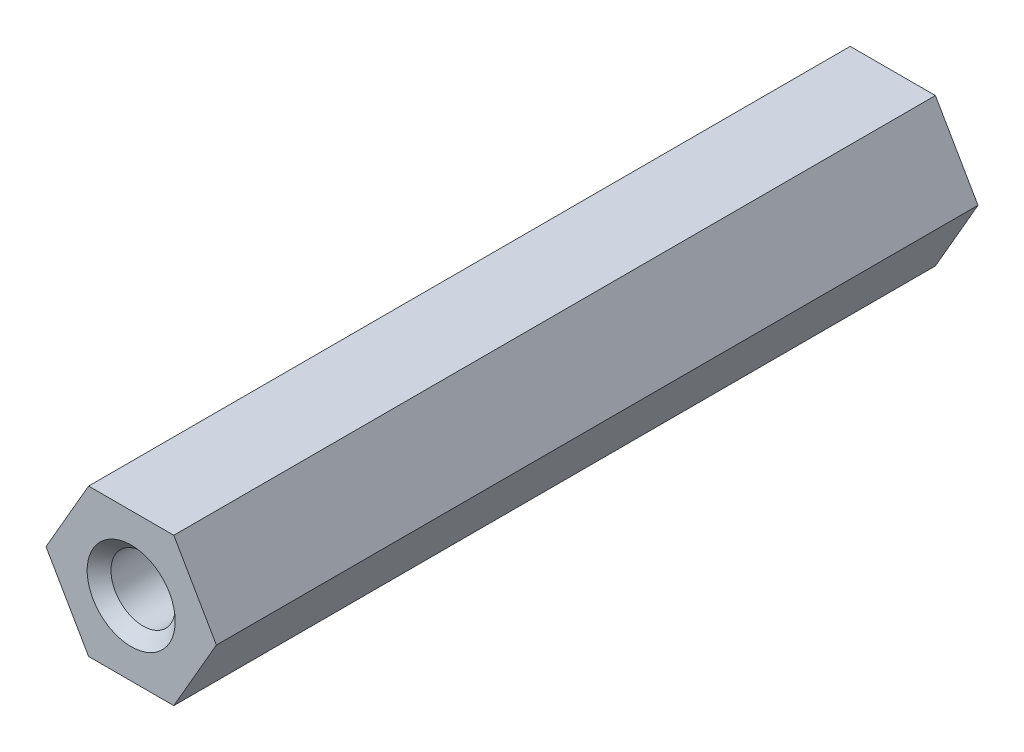
ISO-10303-21;
HEADER;
FILE_DESCRIPTION(('STEP AP214'),'2;1');
FILE_NAME('part.step','',(''),(''),'','','');
FILE_SCHEMA(('AUTOMOTIVE_DESIGN { 1 0 10303 214 1 1 1 1 }'));
ENDSEC;
DATA;
#1=APPLICATION_CONTEXT('core data for automotive mechanical design processes');
#2=APPLICATION_PROTOCOL_DEFINITION('international standard','automotive_design',2000,#1);
#3=PRODUCT_CONTEXT('',#1,'mechanical');
#4=PRODUCT('Part','Part','',(#3));
#5=PRODUCT_RELATED_PRODUCT_CATEGORY('part','',(#4));
#6=PRODUCT_DEFINITION_FORMATION('','',#4);
#7=PRODUCT_DEFINITION_CONTEXT('part definition',#1,'design');
#8=PRODUCT_DEFINITION('design','',#6,#7);
#9=PRODUCT_DEFINITION_SHAPE('','',#8);
#10=(LENGTH_UNIT() NAMED_UNIT(*) SI_UNIT(.MILLI.,.METRE.));
#11=(NAMED_UNIT(*) PLANE_ANGLE_UNIT() SI_UNIT($,.RADIAN.));
#12=(NAMED_UNIT(*) SI_UNIT($,.STERADIAN.) SOLID_ANGLE_UNIT());
#13=UNCERTAINTY_MEASURE_WITH_UNIT(LENGTH_MEASURE(1.E-05),#10,'distance_accuracy_value','');
#14=(GEOMETRIC_REPRESENTATION_CONTEXT(3) GLOBAL_UNCERTAINTY_ASSIGNED_CONTEXT((#13)) GLOBAL_UNIT_ASSIGNED_CONTEXT((#10,
#11,#12)) REPRESENTATION_CONTEXT('',''));
#15=CARTESIAN_POINT('',(0.,0.,0.));
#16=DIRECTION('',(0.,0.,1.));
#17=DIRECTION('',(1.,0.,0.));
#18=AXIS2_PLACEMENT_3D('',#15,#16,#17);
#19=CARTESIAN_POINT('',(-26.2468716349548,-11.1145142617312,4.23950473579815));
#20=DIRECTION('',(0.866025403784438,-0.500000000000001,0.));
#21=DIRECTION('',(0.500000000000001,0.866025403784438,0.));
#22=AXIS2_PLACEMENT_3D('',#19,#20,#21);
#23=PLANE('',#22);
#24=DIRECTION('',(0.500000000000001,0.866025403784438,0.));
#25=VECTOR('',#24,1.);
#26=CARTESIAN_POINT('',(-26.2468716349548,-11.1145142617312,36.2395047357982));
#27=LINE('',#26,#25);
#28=CARTESIAN_POINT('',(-26.2468716349548,-11.1145142617312,36.2395047357982));
#29=VERTEX_POINT('',#28);
#30=CARTESIAN_POINT('',(-24.4570858004669,-8.01451426173116,36.2395047357982));
#31=VERTEX_POINT('',#30);
#32=EDGE_CURVE('E126',#29,#31,#27,.T.);
#33=ORIENTED_EDGE('',*,*,#32,.F.);
#34=DIRECTION('',(0.,0.,1.));
#35=VECTOR('',#34,1.);
#36=CARTESIAN_POINT('',(-26.2468716349548,-11.1145142617312,4.23950473579815));
#37=LINE('',#36,#35);
#38=CARTESIAN_POINT('',(-26.2468716349548,-11.1145142617312,4.23950473579815));
#39=VERTEX_POINT('',#38);
#40=EDGE_CURVE('E55',#39,#29,#37,.T.);
#41=ORIENTED_EDGE('',*,*,#40,.F.);
#42=DIRECTION('',(0.500000000000001,0.866025403784438,0.));
#43=VECTOR('',#42,1.);
#44=CARTESIAN_POINT('',(-26.2468716349548,-11.1145142617312,4.23950473579815));
#45=LINE('',#44,#43);
#46=CARTESIAN_POINT('',(-24.4570858004669,-8.01451426173116,4.23950473579815));
#47=VERTEX_POINT('',#46);
#48=EDGE_CURVE('E141',#39,#47,#45,.T.);
#49=ORIENTED_EDGE('',*,*,#48,.T.);
#50=DIRECTION('',(0.,0.,1.));
#51=VECTOR('',#50,1.);
#52=CARTESIAN_POINT('',(-24.4570858004669,-8.01451426173116,4.23950473579815));
#53=LINE('',#52,#51);
#54=EDGE_CURVE('E90',#47,#31,#53,.T.);
#55=ORIENTED_EDGE('',*,*,#54,.T.);
#56=EDGE_LOOP('',(#33,#41,#49,#55));
#57=FACE_BOUND('',#56,.T.);
#58=ADVANCED_FACE('F37',(#57),#23,.T.);
#59=CARTESIAN_POINT('',(-29.8264433039305,-11.1145142617312,4.23950473579815));
#60=DIRECTION('',(0.,-1.,0.));
#61=DIRECTION('',(0.,0.,-1.));
#62=AXIS2_PLACEMENT_3D('',#59,#60,#61);
#63=PLANE('',#62);
#64=DIRECTION('',(1.,0.,0.));
#65=VECTOR('',#64,1.);
#66=CARTESIAN_POINT('',(-29.8264433039305,-11.1145142617312,36.2395047357982));
#67=LINE('',#66,#65);
#68=CARTESIAN_POINT('',(-29.8264433039305,-11.1145142617312,36.2395047357982));
#69=VERTEX_POINT('',#68);
#70=EDGE_CURVE('E138',#69,#29,#67,.T.);
#71=ORIENTED_EDGE('',*,*,#70,.F.);
#72=DIRECTION('',(0.,0.,1.));
#73=VECTOR('',#72,1.);
#74=CARTESIAN_POINT('',(-29.8264433039305,-11.1145142617312,4.23950473579815));
#75=LINE('',#74,#73);
#76=CARTESIAN_POINT('',(-29.8264433039305,-11.1145142617312,4.23950473579815));
#77=VERTEX_POINT('',#76);
#78=EDGE_CURVE('E78',#77,#69,#75,.T.);
#79=ORIENTED_EDGE('',*,*,#78,.F.);
#80=DIRECTION('',(1.,0.,0.));
#81=VECTOR('',#80,1.);
#82=CARTESIAN_POINT('',(-29.8264433039305,-11.1145142617312,4.23950473579815));
#83=LINE('',#82,#81);
#84=EDGE_CURVE('E116',#77,#39,#83,.T.);
#85=ORIENTED_EDGE('',*,*,#84,.T.);
#86=ORIENTED_EDGE('',*,*,#40,.T.);
#87=EDGE_LOOP('',(#71,#79,#85,#86));
#88=FACE_BOUND('',#87,.T.);
#89=ADVANCED_FACE('F178',(#88),#63,.T.);
#90=CARTESIAN_POINT('',(-31.6162291384183,-8.01451426173116,4.23950473579815));
#91=DIRECTION('',(-0.866025403784438,-0.5,0.));
#92=DIRECTION('',(0.5,-0.866025403784439,0.));
#93=AXIS2_PLACEMENT_3D('',#90,#91,#92);
#94=PLANE('',#93);
#95=DIRECTION('',(0.5,-0.866025403784438,0.));
#96=VECTOR('',#95,1.);
#97=CARTESIAN_POINT('',(-31.6162291384183,-8.01451426173116,36.2395047357982));
#98=LINE('',#97,#96);
#99=CARTESIAN_POINT('',(-31.6162291384183,-8.01451426173116,36.2395047357982));
#100=VERTEX_POINT('',#99);
#101=EDGE_CURVE('E103',#100,#69,#98,.T.);
#102=ORIENTED_EDGE('',*,*,#101,.F.);
#103=DIRECTION('',(0.,0.,1.));
#104=VECTOR('',#103,1.);
#105=CARTESIAN_POINT('',(-31.6162291384183,-8.01451426173116,4.23950473579815));
#106=LINE('',#105,#104);
#107=CARTESIAN_POINT('',(-31.6162291384183,-8.01451426173116,4.23950473579815));
#108=VERTEX_POINT('',#107);
#109=EDGE_CURVE('E98',#108,#100,#106,.T.);
#110=ORIENTED_EDGE('',*,*,#109,.F.);
#111=DIRECTION('',(0.5,-0.866025403784438,0.));
#112=VECTOR('',#111,1.);
#113=CARTESIAN_POINT('',(-31.6162291384183,-8.01451426173116,4.23950473579815));
#114=LINE('',#113,#112);
#115=EDGE_CURVE('E101',#108,#77,#114,.T.);
#116=ORIENTED_EDGE('',*,*,#115,.T.);
#117=ORIENTED_EDGE('',*,*,#78,.T.);
#118=EDGE_LOOP('',(#102,#110,#116,#117));
#119=FACE_BOUND('',#118,.T.);
#120=ADVANCED_FACE('F100',(#119),#94,.T.);
#121=CARTESIAN_POINT('',(-29.8264433039305,-4.91451426173116,4.23950473579815));
#122=DIRECTION('',(-0.866025403784438,0.5,0.));
#123=DIRECTION('',(-0.5,-0.866025403784439,0.));
#124=AXIS2_PLACEMENT_3D('',#121,#122,#123);
#125=PLANE('',#124);
#126=DIRECTION('',(-0.5,-0.866025403784438,0.));
#127=VECTOR('',#126,1.);
#128=CARTESIAN_POINT('',(-29.8264433039305,-4.91451426173116,36.2395047357982));
#129=LINE('',#128,#127);
#130=CARTESIAN_POINT('',(-29.8264433039305,-4.91451426173116,36.2395047357982));
#131=VERTEX_POINT('',#130);
#132=EDGE_CURVE('E135',#131,#100,#129,.T.);
#133=ORIENTED_EDGE('',*,*,#132,.F.);
#134=DIRECTION('',(0.,0.,1.));
#135=VECTOR('',#134,1.);
#136=CARTESIAN_POINT('',(-29.8264433039305,-4.91451426173116,4.23950473579815));
#137=LINE('',#136,#135);
#138=CARTESIAN_POINT('',(-29.8264433039305,-4.91451426173116,4.23950473579815));
#139=VERTEX_POINT('',#138);
#140=EDGE_CURVE('E108',#139,#131,#137,.T.);
#141=ORIENTED_EDGE('',*,*,#140,.F.);
#142=DIRECTION('',(-0.5,-0.866025403784438,0.));
#143=VECTOR('',#142,1.);
#144=CARTESIAN_POINT('',(-29.8264433039305,-4.91451426173116,4.23950473579815));
#145=LINE('',#144,#143);
#146=EDGE_CURVE('E114',#139,#108,#145,.T.);
#147=ORIENTED_EDGE('',*,*,#146,.T.);
#148=ORIENTED_EDGE('',*,*,#109,.T.);
#149=EDGE_LOOP('',(#133,#141,#147,#148));
#150=FACE_BOUND('',#149,.T.);
#151=ADVANCED_FACE('F118',(#150),#125,.T.);
#152=CARTESIAN_POINT('',(-26.2468716349548,-4.91451426173116,4.23950473579815));
#153=DIRECTION('',(0.,1.,0.));
#154=DIRECTION('',(-1.,0.,0.));
#155=AXIS2_PLACEMENT_3D('',#152,#153,#154);
#156=PLANE('',#155);
#157=DIRECTION('',(-1.,0.,0.));
#158=VECTOR('',#157,1.);
#159=CARTESIAN_POINT('',(-26.2468716349548,-4.91451426173116,36.2395047357982));
#160=LINE('',#159,#158);
#161=CARTESIAN_POINT('',(-26.2468716349548,-4.91451426173116,36.2395047357982));
#162=VERTEX_POINT('',#161);
#163=EDGE_CURVE('E132',#162,#131,#160,.T.);
#164=ORIENTED_EDGE('',*,*,#163,.F.);
#165=DIRECTION('',(0.,0.,1.));
#166=VECTOR('',#165,1.);
#167=CARTESIAN_POINT('',(-26.2468716349548,-4.91451426173116,4.23950473579815));
#168=LINE('',#167,#166);
#169=CARTESIAN_POINT('',(-26.2468716349548,-4.91451426173116,4.23950473579815));
#170=VERTEX_POINT('',#169);
#171=EDGE_CURVE('E146',#170,#162,#168,.T.);
#172=ORIENTED_EDGE('',*,*,#171,.F.);
#173=DIRECTION('',(-1.,0.,0.));
#174=VECTOR('',#173,1.);
#175=CARTESIAN_POINT('',(-26.2468716349548,-4.91451426173116,4.23950473579815));
#176=LINE('',#175,#174);
#177=EDGE_CURVE('E119',#170,#139,#176,.T.);
#178=ORIENTED_EDGE('',*,*,#177,.T.);
#179=ORIENTED_EDGE('',*,*,#140,.T.);
#180=EDGE_LOOP('',(#164,#172,#178,#179));
#181=FACE_BOUND('',#180,.T.);
#182=ADVANCED_FACE('F174',(#181),#156,.T.);
#183=CARTESIAN_POINT('',(-24.4570858004669,-8.01451426173116,4.23950473579815));
#184=DIRECTION('',(0.866025403784438,0.5,0.));
#185=DIRECTION('',(-0.5,0.866025403784439,0.));
#186=AXIS2_PLACEMENT_3D('',#183,#184,#185);
#187=PLANE('',#186);
#188=DIRECTION('',(-0.5,0.866025403784439,0.));
#189=VECTOR('',#188,1.);
#190=CARTESIAN_POINT('',(-24.4570858004669,-8.01451426173116,36.2395047357982));
#191=LINE('',#190,#189);
#192=EDGE_CURVE('E129',#31,#162,#191,.T.);
#193=ORIENTED_EDGE('',*,*,#192,.F.);
#194=ORIENTED_EDGE('',*,*,#54,.F.);
#195=DIRECTION('',(-0.5,0.866025403784439,0.));
#196=VECTOR('',#195,1.);
#197=CARTESIAN_POINT('',(-24.4570858004669,-8.01451426173116,4.23950473579815));
#198=LINE('',#197,#196);
#199=EDGE_CURVE('E121',#47,#170,#198,.T.);
#200=ORIENTED_EDGE('',*,*,#199,.T.);
#201=ORIENTED_EDGE('',*,*,#171,.T.);
#202=EDGE_LOOP('',(#193,#194,#200,#201));
#203=FACE_BOUND('',#202,.T.);
#204=ADVANCED_FACE('F166',(#203),#187,.T.);
#205=CARTESIAN_POINT('',(0.,0.,4.23950473579815));
#206=DIRECTION('',(0.,0.,1.));
#207=DIRECTION('',(1.,0.,0.));
#208=AXIS2_PLACEMENT_3D('',#205,#206,#207);
#209=PLANE('',#208);
#210=CARTESIAN_POINT('',(-28.0366574694424,-8.01451426173113,4.23950473579815));
#211=DIRECTION('',(0.,0.,1.));
#212=DIRECTION('',(1.,0.,0.));
#213=AXIS2_PLACEMENT_3D('',#210,#211,#212);
#214=CIRCLE('',#213,1.85000000000477);
#215=CARTESIAN_POINT('',(-26.1866574694376,-8.01451426173113,4.23950473579815));
#216=VERTEX_POINT('',#215);
#217=EDGE_CURVE('E143',#216,#216,#214,.T.);
#218=ORIENTED_EDGE('',*,*,#217,.T.);
#219=EDGE_LOOP('',(#218));
#220=FACE_BOUND('',#219,.T.);
#221=ORIENTED_EDGE('',*,*,#48,.F.);
#222=ORIENTED_EDGE('',*,*,#84,.F.);
#223=ORIENTED_EDGE('',*,*,#115,.F.);
#224=ORIENTED_EDGE('',*,*,#146,.F.);
#225=ORIENTED_EDGE('',*,*,#177,.F.);
#226=ORIENTED_EDGE('',*,*,#199,.F.);
#227=EDGE_LOOP('',(#221,#222,#223,#224,#225,#226));
#228=FACE_BOUND('',#227,.T.);
#229=ADVANCED_FACE('F112',(#220,#228),#209,.F.);
#230=CARTESIAN_POINT('',(0.,0.,36.2395047357982));
#231=DIRECTION('',(0.,0.,1.));
#232=DIRECTION('',(1.,0.,0.));
#233=AXIS2_PLACEMENT_3D('',#230,#231,#232);
#234=PLANE('',#233);
#235=CARTESIAN_POINT('',(-28.0366574694424,-8.01451426173113,36.2395047357982));
#236=DIRECTION('',(0.,0.,1.));
#237=DIRECTION('',(1.,0.,0.));
#238=AXIS2_PLACEMENT_3D('',#235,#236,#237);
#239=CIRCLE('',#238,1.84999999994811);
#240=CARTESIAN_POINT('',(-26.1866574694943,-8.01451426173113,36.2395047357982));
#241=VERTEX_POINT('',#240);
#242=EDGE_CURVE('E11',#241,#241,#239,.F.);
#243=ORIENTED_EDGE('',*,*,#242,.T.);
#244=EDGE_LOOP('',(#243));
#245=FACE_BOUND('',#244,.T.);
#246=ORIENTED_EDGE('',*,*,#32,.T.);
#247=ORIENTED_EDGE('',*,*,#192,.T.);
#248=ORIENTED_EDGE('',*,*,#163,.T.);
#249=ORIENTED_EDGE('',*,*,#132,.T.);
#250=ORIENTED_EDGE('',*,*,#101,.T.);
#251=ORIENTED_EDGE('',*,*,#70,.T.);
#252=EDGE_LOOP('',(#246,#247,#248,#249,#250,#251));
#253=FACE_BOUND('',#252,.T.);
#254=ADVANCED_FACE('F165',(#245,#253),#234,.T.);
#255=CARTESIAN_POINT('',(-28.0366574694424,-8.01451426173113,36.2395047357982));
#256=DIRECTION('',(0.,0.,1.));
#257=DIRECTION('',(1.,0.,0.));
#258=AXIS2_PLACEMENT_3D('',#255,#256,#257);
#259=CYLINDRICAL_SURFACE('',#258,1.34999999999998);
#260=CARTESIAN_POINT('',(-28.0366574694424,-8.01451426173113,4.73950473574611));
#261=DIRECTION('',(0.,0.,1.));
#262=DIRECTION('',(1.,0.,0.));
#263=AXIS2_PLACEMENT_3D('',#260,#261,#262);
#264=CIRCLE('',#263,1.34999999999998);
#265=CARTESIAN_POINT('',(-26.6866574694424,-8.01451426173113,4.73950473574611));
#266=VERTEX_POINT('',#265);
#267=EDGE_CURVE('E47',#266,#266,#264,.F.);
#268=ORIENTED_EDGE('',*,*,#267,.T.);
#269=EDGE_LOOP('',(#268));
#270=FACE_BOUND('',#269,.T.);
#271=CARTESIAN_POINT('',(-28.0366574694424,-8.01451426173113,35.7395047357932));
#272=DIRECTION('',(0.,0.,1.));
#273=DIRECTION('',(1.,0.,0.));
#274=AXIS2_PLACEMENT_3D('',#271,#272,#273);
#275=CIRCLE('',#274,1.34999999999998);
#276=CARTESIAN_POINT('',(-26.6866574694424,-8.01451426173113,35.7395047357932));
#277=VERTEX_POINT('',#276);
#278=EDGE_CURVE('E151',#277,#277,#275,.T.);
#279=ORIENTED_EDGE('',*,*,#278,.T.);
#280=EDGE_LOOP('',(#279));
#281=FACE_BOUND('',#280,.T.);
#282=ADVANCED_FACE('F156',(#270,#281),#259,.F.);
#283=CARTESIAN_POINT('',(-28.0366574694424,-8.01451426173113,4.23950473579815));
#284=DIRECTION('',(0.,0.,-1.));
#285=DIRECTION('',(-1.,0.,0.));
#286=AXIS2_PLACEMENT_3D('',#283,#284,#285);
#287=CONICAL_SURFACE('',#286,1.85000000000477,0.78539816345428);
#288=ORIENTED_EDGE('',*,*,#267,.F.);
#289=EDGE_LOOP('',(#288));
#290=FACE_BOUND('',#289,.T.);
#291=ORIENTED_EDGE('',*,*,#217,.F.);
#292=EDGE_LOOP('',(#291));
#293=FACE_BOUND('',#292,.T.);
#294=ADVANCED_FACE('F159',(#290,#293),#287,.F.);
#295=CARTESIAN_POINT('',(-28.0366574694424,-8.01451426173113,35.7395047357932));
#296=DIRECTION('',(0.,0.,1.));
#297=DIRECTION('',(1.,0.,0.));
#298=AXIS2_PLACEMENT_3D('',#295,#296,#297);
#299=CONICAL_SURFACE('',#298,1.34999999999998,0.785398163340607);
#300=ORIENTED_EDGE('',*,*,#242,.F.);
#301=EDGE_LOOP('',(#300));
#302=FACE_BOUND('',#301,.T.);
#303=ORIENTED_EDGE('',*,*,#278,.F.);
#304=EDGE_LOOP('',(#303));
#305=FACE_BOUND('',#304,.T.);
#306=ADVANCED_FACE('F40',(#302,#305),#299,.F.);
#307=CLOSED_SHELL('',(#58,#89,#120,#151,#182,#204,#229,#254,#282,#294,#306));
#308=MANIFOLD_SOLID_BREP('B2',#307);
#309=ADVANCED_BREP_SHAPE_REPRESENTATION('',(#18,#308),#14);
#310=SHAPE_DEFINITION_REPRESENTATION(#9,#309);
ENDSEC;
END-ISO-10303-21;
